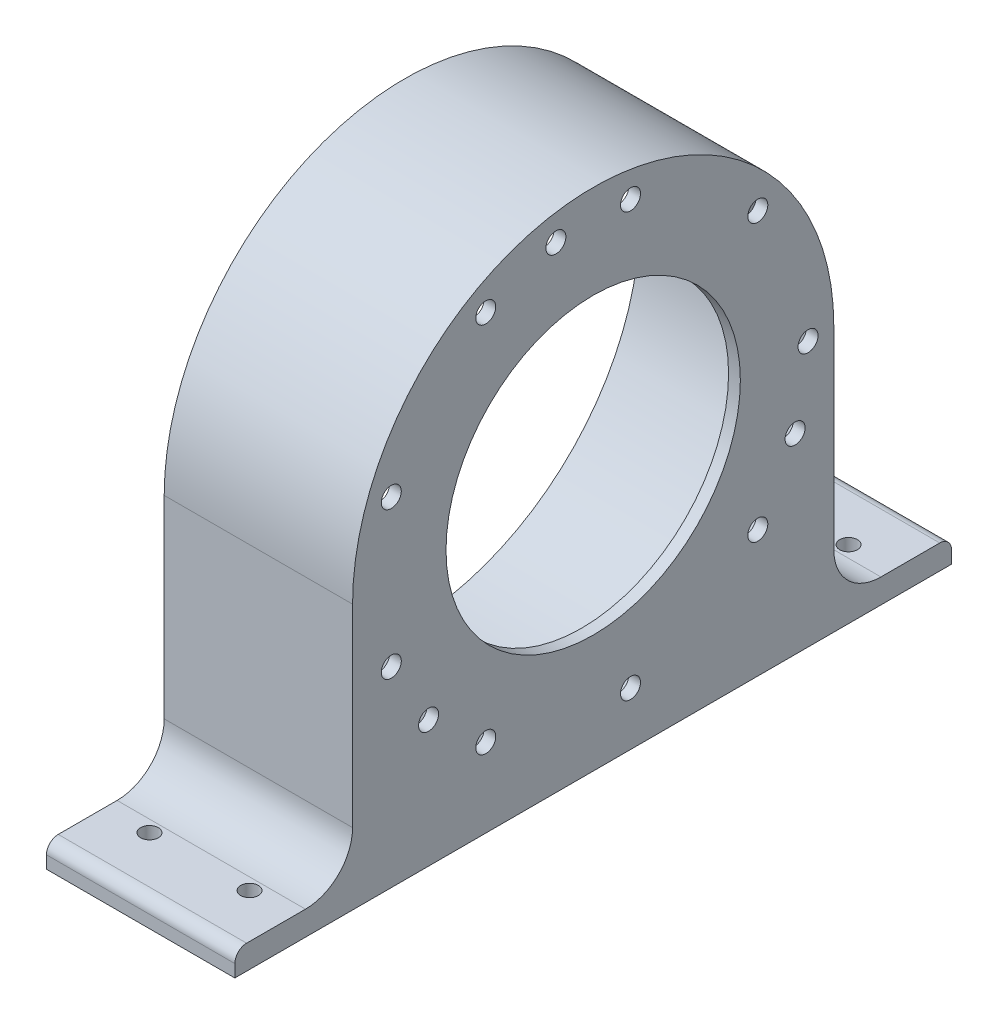
ISO-10303-21;
HEADER;
FILE_DESCRIPTION(('STEP AP214'),'2;1');
FILE_NAME('part.step','',(''),(''),'','','');
FILE_SCHEMA(('AUTOMOTIVE_DESIGN { 1 0 10303 214 1 1 1 1 }'));
ENDSEC;
DATA;
#1=APPLICATION_CONTEXT('core data for automotive mechanical design processes');
#2=APPLICATION_PROTOCOL_DEFINITION('international standard','automotive_design',2000,#1);
#3=PRODUCT_CONTEXT('',#1,'mechanical');
#4=PRODUCT('Part','Part','',(#3));
#5=PRODUCT_RELATED_PRODUCT_CATEGORY('part','',(#4));
#6=PRODUCT_DEFINITION_FORMATION('','',#4);
#7=PRODUCT_DEFINITION_CONTEXT('part definition',#1,'design');
#8=PRODUCT_DEFINITION('design','',#6,#7);
#9=PRODUCT_DEFINITION_SHAPE('','',#8);
#10=(LENGTH_UNIT() NAMED_UNIT(*) SI_UNIT(.MILLI.,.METRE.));
#11=(NAMED_UNIT(*) PLANE_ANGLE_UNIT() SI_UNIT($,.RADIAN.));
#12=(NAMED_UNIT(*) SI_UNIT($,.STERADIAN.) SOLID_ANGLE_UNIT());
#13=UNCERTAINTY_MEASURE_WITH_UNIT(LENGTH_MEASURE(1.E-05),#10,'distance_accuracy_value','');
#14=(GEOMETRIC_REPRESENTATION_CONTEXT(3) GLOBAL_UNCERTAINTY_ASSIGNED_CONTEXT((#13)) GLOBAL_UNIT_ASSIGNED_CONTEXT((#10,
#11,#12)) REPRESENTATION_CONTEXT('',''));
#15=CARTESIAN_POINT('',(0.,0.,0.));
#16=DIRECTION('',(0.,0.,1.));
#17=DIRECTION('',(1.,0.,0.));
#18=AXIS2_PLACEMENT_3D('',#15,#16,#17);
#19=CARTESIAN_POINT('',(-32.,0.,0.));
#20=DIRECTION('',(1.,0.,0.));
#21=DIRECTION('',(0.,0.,-1.));
#22=AXIS2_PLACEMENT_3D('',#19,#20,#21);
#23=CYLINDRICAL_SURFACE('',#22,40.875);
#24=CARTESIAN_POINT('',(0.,0.,0.));
#25=DIRECTION('',(1.,0.,0.));
#26=DIRECTION('',(0.,0.,1.));
#27=AXIS2_PLACEMENT_3D('',#24,#25,#26);
#28=CIRCLE('',#27,40.875);
#29=CARTESIAN_POINT('',(0.,0.,-40.875));
#30=VERTEX_POINT('',#29);
#31=CARTESIAN_POINT('',(0.,0.,40.875));
#32=VERTEX_POINT('',#31);
#33=EDGE_CURVE('E181',#30,#32,#28,.T.);
#34=ORIENTED_EDGE('',*,*,#33,.F.);
#35=DIRECTION('',(1.,0.,0.));
#36=VECTOR('',#35,1.);
#37=CARTESIAN_POINT('',(-32.,0.,-40.875));
#38=LINE('',#37,#36);
#39=CARTESIAN_POINT('',(-32.,0.,-40.875));
#40=VERTEX_POINT('',#39);
#41=EDGE_CURVE('E160',#40,#30,#38,.T.);
#42=ORIENTED_EDGE('',*,*,#41,.F.);
#43=CARTESIAN_POINT('',(-32.,0.,0.));
#44=DIRECTION('',(1.,0.,0.));
#45=DIRECTION('',(0.,0.,1.));
#46=AXIS2_PLACEMENT_3D('',#43,#44,#45);
#47=CIRCLE('',#46,40.875);
#48=CARTESIAN_POINT('',(-32.,0.,40.875));
#49=VERTEX_POINT('',#48);
#50=EDGE_CURVE('E153',#40,#49,#47,.T.);
#51=ORIENTED_EDGE('',*,*,#50,.T.);
#52=DIRECTION('',(1.,0.,0.));
#53=VECTOR('',#52,1.);
#54=CARTESIAN_POINT('',(-32.,0.,40.875));
#55=LINE('',#54,#53);
#56=EDGE_CURVE('E134',#49,#32,#55,.T.);
#57=ORIENTED_EDGE('',*,*,#56,.T.);
#58=EDGE_LOOP('',(#34,#42,#51,#57));
#59=FACE_BOUND('',#58,.T.);
#60=ADVANCED_FACE('F43',(#59),#23,.T.);
#61=CARTESIAN_POINT('',(-32.,-40.875,-40.875));
#62=DIRECTION('',(0.,0.,-1.));
#63=DIRECTION('',(-1.,0.,0.));
#64=AXIS2_PLACEMENT_3D('',#61,#62,#63);
#65=PLANE('',#64);
#66=DIRECTION('',(0.,1.,0.));
#67=VECTOR('',#66,1.);
#68=CARTESIAN_POINT('',(0.,-40.875,-40.875));
#69=LINE('',#68,#67);
#70=CARTESIAN_POINT('',(0.,-32.875,-40.875));
#71=VERTEX_POINT('',#70);
#72=EDGE_CURVE('E161',#71,#30,#69,.T.);
#73=ORIENTED_EDGE('',*,*,#72,.F.);
#74=DIRECTION('',(1.,0.,0.));
#75=VECTOR('',#74,1.);
#76=CARTESIAN_POINT('',(-32.,-32.875,-40.875));
#77=LINE('',#76,#75);
#78=CARTESIAN_POINT('',(-32.,-32.875,-40.875));
#79=VERTEX_POINT('',#78);
#80=EDGE_CURVE('E217',#71,#79,#77,.F.);
#81=ORIENTED_EDGE('',*,*,#80,.T.);
#82=DIRECTION('',(0.,1.,0.));
#83=VECTOR('',#82,1.);
#84=CARTESIAN_POINT('',(-32.,-40.875,-40.875));
#85=LINE('',#84,#83);
#86=EDGE_CURVE('E147',#79,#40,#85,.T.);
#87=ORIENTED_EDGE('',*,*,#86,.T.);
#88=ORIENTED_EDGE('',*,*,#41,.T.);
#89=EDGE_LOOP('',(#73,#81,#87,#88));
#90=FACE_BOUND('',#89,.T.);
#91=ADVANCED_FACE('F362',(#90),#65,.T.);
#92=CARTESIAN_POINT('',(-32.,-40.8749999999999,-60.875));
#93=DIRECTION('',(0.,1.,0.));
#94=DIRECTION('',(0.,0.,1.));
#95=AXIS2_PLACEMENT_3D('',#92,#93,#94);
#96=PLANE('',#95);
#97=CARTESIAN_POINT('',(-24.5,-40.875,-50.875));
#98=DIRECTION('',(0.,1.,0.));
#99=DIRECTION('',(0.,0.,1.));
#100=AXIS2_PLACEMENT_3D('',#97,#98,#99);
#101=CIRCLE('',#100,1.5);
#102=CARTESIAN_POINT('',(-24.5,-40.875,-49.375));
#103=VERTEX_POINT('',#102);
#104=EDGE_CURVE('E245',#103,#103,#101,.F.);
#105=ORIENTED_EDGE('',*,*,#104,.T.);
#106=EDGE_LOOP('',(#105));
#107=FACE_BOUND('',#106,.T.);
#108=CARTESIAN_POINT('',(-7.5,-40.875,-50.875));
#109=DIRECTION('',(0.,1.,0.));
#110=DIRECTION('',(0.,0.,1.));
#111=AXIS2_PLACEMENT_3D('',#108,#109,#110);
#112=CIRCLE('',#111,1.5);
#113=CARTESIAN_POINT('',(-7.5,-40.875,-49.375));
#114=VERTEX_POINT('',#113);
#115=EDGE_CURVE('E299',#114,#114,#112,.F.);
#116=ORIENTED_EDGE('',*,*,#115,.T.);
#117=EDGE_LOOP('',(#116));
#118=FACE_BOUND('',#117,.T.);
#119=DIRECTION('',(0.,0.,1.));
#120=VECTOR('',#119,1.);
#121=CARTESIAN_POINT('',(0.,-40.8749999999999,-60.875));
#122=LINE('',#121,#120);
#123=CARTESIAN_POINT('',(0.,-40.8749999999999,-58.875));
#124=VERTEX_POINT('',#123);
#125=CARTESIAN_POINT('',(0.,-40.875,-48.875));
#126=VERTEX_POINT('',#125);
#127=EDGE_CURVE('E163',#124,#126,#122,.T.);
#128=ORIENTED_EDGE('',*,*,#127,.F.);
#129=DIRECTION('',(1.,0.,0.));
#130=VECTOR('',#129,1.);
#131=CARTESIAN_POINT('',(-32.,-40.8749999999999,-58.875));
#132=LINE('',#131,#130);
#133=CARTESIAN_POINT('',(-32.,-40.8749999999999,-58.875));
#134=VERTEX_POINT('',#133);
#135=EDGE_CURVE('E234',#124,#134,#132,.F.);
#136=ORIENTED_EDGE('',*,*,#135,.T.);
#137=DIRECTION('',(0.,0.,1.));
#138=VECTOR('',#137,1.);
#139=CARTESIAN_POINT('',(-32.,-40.8749999999999,-60.875));
#140=LINE('',#139,#138);
#141=CARTESIAN_POINT('',(-32.,-40.875,-48.875));
#142=VERTEX_POINT('',#141);
#143=EDGE_CURVE('E178',#134,#142,#140,.T.);
#144=ORIENTED_EDGE('',*,*,#143,.T.);
#145=DIRECTION('',(1.,0.,0.));
#146=VECTOR('',#145,1.);
#147=CARTESIAN_POINT('',(0.,-40.875,-48.875));
#148=LINE('',#147,#146);
#149=EDGE_CURVE('E214',#142,#126,#148,.T.);
#150=ORIENTED_EDGE('',*,*,#149,.T.);
#151=EDGE_LOOP('',(#128,#136,#144,#150));
#152=FACE_BOUND('',#151,.T.);
#153=ADVANCED_FACE('F368',(#107,#118,#152),#96,.T.);
#154=CARTESIAN_POINT('',(-32.,-40.8749999999999,-60.875));
#155=DIRECTION('',(0.,0.,-1.));
#156=DIRECTION('',(-1.,0.,0.));
#157=AXIS2_PLACEMENT_3D('',#154,#155,#156);
#158=PLANE('',#157);
#159=DIRECTION('',(0.,1.,0.));
#160=VECTOR('',#159,1.);
#161=CARTESIAN_POINT('',(-32.,-40.8749999999999,-60.875));
#162=LINE('',#161,#160);
#163=CARTESIAN_POINT('',(-32.,-45.,-60.875));
#164=VERTEX_POINT('',#163);
#165=CARTESIAN_POINT('',(-32.,-42.8749999999999,-60.875));
#166=VERTEX_POINT('',#165);
#167=EDGE_CURVE('E175',#164,#166,#162,.T.);
#168=ORIENTED_EDGE('',*,*,#167,.T.);
#169=DIRECTION('',(1.,0.,0.));
#170=VECTOR('',#169,1.);
#171=CARTESIAN_POINT('',(-32.,-42.8749999999999,-60.875));
#172=LINE('',#171,#170);
#173=CARTESIAN_POINT('',(0.,-42.8749999999999,-60.875));
#174=VERTEX_POINT('',#173);
#175=EDGE_CURVE('E227',#166,#174,#172,.T.);
#176=ORIENTED_EDGE('',*,*,#175,.T.);
#177=DIRECTION('',(0.,1.,0.));
#178=VECTOR('',#177,1.);
#179=CARTESIAN_POINT('',(0.,-40.8749999999999,-60.875));
#180=LINE('',#179,#178);
#181=CARTESIAN_POINT('',(0.,-45.,-60.875));
#182=VERTEX_POINT('',#181);
#183=EDGE_CURVE('E193',#182,#174,#180,.T.);
#184=ORIENTED_EDGE('',*,*,#183,.F.);
#185=DIRECTION('',(1.,0.,0.));
#186=VECTOR('',#185,1.);
#187=CARTESIAN_POINT('',(-32.,-45.,-60.875));
#188=LINE('',#187,#186);
#189=EDGE_CURVE('E199',#164,#182,#188,.T.);
#190=ORIENTED_EDGE('',*,*,#189,.F.);
#191=EDGE_LOOP('',(#168,#176,#184,#190));
#192=FACE_BOUND('',#191,.T.);
#193=ADVANCED_FACE('F391',(#192),#158,.T.);
#194=CARTESIAN_POINT('',(-32.,-45.,60.875));
#195=DIRECTION('',(0.,-1.,0.));
#196=DIRECTION('',(0.,0.,-1.));
#197=AXIS2_PLACEMENT_3D('',#194,#195,#196);
#198=PLANE('',#197);
#199=CARTESIAN_POINT('',(-7.5,-45.,50.875));
#200=DIRECTION('',(0.,-1.,0.));
#201=DIRECTION('',(0.,0.,-1.));
#202=AXIS2_PLACEMENT_3D('',#199,#200,#201);
#203=CIRCLE('',#202,1.5);
#204=CARTESIAN_POINT('',(-7.5,-45.,49.375));
#205=VERTEX_POINT('',#204);
#206=EDGE_CURVE('E296',#205,#205,#203,.F.);
#207=ORIENTED_EDGE('',*,*,#206,.T.);
#208=EDGE_LOOP('',(#207));
#209=FACE_BOUND('',#208,.T.);
#210=CARTESIAN_POINT('',(-24.5,-45.,50.875));
#211=DIRECTION('',(0.,-1.,0.));
#212=DIRECTION('',(0.,0.,-1.));
#213=AXIS2_PLACEMENT_3D('',#210,#211,#212);
#214=CIRCLE('',#213,1.5);
#215=CARTESIAN_POINT('',(-24.5,-45.,49.375));
#216=VERTEX_POINT('',#215);
#217=EDGE_CURVE('E293',#216,#216,#214,.F.);
#218=ORIENTED_EDGE('',*,*,#217,.T.);
#219=EDGE_LOOP('',(#218));
#220=FACE_BOUND('',#219,.T.);
#221=CARTESIAN_POINT('',(-24.5,-45.,-50.875));
#222=DIRECTION('',(0.,-1.,0.));
#223=DIRECTION('',(0.,0.,-1.));
#224=AXIS2_PLACEMENT_3D('',#221,#222,#223);
#225=CIRCLE('',#224,1.5);
#226=CARTESIAN_POINT('',(-24.5,-45.,-52.375));
#227=VERTEX_POINT('',#226);
#228=EDGE_CURVE('E47',#227,#227,#225,.F.);
#229=ORIENTED_EDGE('',*,*,#228,.T.);
#230=EDGE_LOOP('',(#229));
#231=FACE_BOUND('',#230,.T.);
#232=CARTESIAN_POINT('',(-7.5,-45.,-50.875));
#233=DIRECTION('',(0.,-1.,0.));
#234=DIRECTION('',(0.,0.,-1.));
#235=AXIS2_PLACEMENT_3D('',#232,#233,#234);
#236=CIRCLE('',#235,1.5);
#237=CARTESIAN_POINT('',(-7.5,-45.,-52.375));
#238=VERTEX_POINT('',#237);
#239=EDGE_CURVE('E297',#238,#238,#236,.F.);
#240=ORIENTED_EDGE('',*,*,#239,.T.);
#241=EDGE_LOOP('',(#240));
#242=FACE_BOUND('',#241,.T.);
#243=DIRECTION('',(0.,0.,-1.));
#244=VECTOR('',#243,1.);
#245=CARTESIAN_POINT('',(0.,-45.,60.875));
#246=LINE('',#245,#244);
#247=CARTESIAN_POINT('',(0.,-45.,60.875));
#248=VERTEX_POINT('',#247);
#249=EDGE_CURVE('E190',#248,#182,#246,.T.);
#250=ORIENTED_EDGE('',*,*,#249,.F.);
#251=DIRECTION('',(1.,0.,0.));
#252=VECTOR('',#251,1.);
#253=CARTESIAN_POINT('',(-32.,-45.,60.875));
#254=LINE('',#253,#252);
#255=CARTESIAN_POINT('',(-32.,-45.,60.875));
#256=VERTEX_POINT('',#255);
#257=EDGE_CURVE('E146',#256,#248,#254,.T.);
#258=ORIENTED_EDGE('',*,*,#257,.F.);
#259=DIRECTION('',(0.,0.,-1.));
#260=VECTOR('',#259,1.);
#261=CARTESIAN_POINT('',(-32.,-45.,60.875));
#262=LINE('',#261,#260);
#263=EDGE_CURVE('E172',#256,#164,#262,.T.);
#264=ORIENTED_EDGE('',*,*,#263,.T.);
#265=ORIENTED_EDGE('',*,*,#189,.T.);
#266=EDGE_LOOP('',(#250,#258,#264,#265));
#267=FACE_BOUND('',#266,.T.);
#268=ADVANCED_FACE('F395',(#209,#220,#231,#242,#267),#198,.T.);
#269=CARTESIAN_POINT('',(-32.,-40.875,60.875));
#270=DIRECTION('',(0.,0.,1.));
#271=DIRECTION('',(1.,0.,0.));
#272=AXIS2_PLACEMENT_3D('',#269,#270,#271);
#273=PLANE('',#272);
#274=DIRECTION('',(0.,-1.,0.));
#275=VECTOR('',#274,1.);
#276=CARTESIAN_POINT('',(0.,-40.875,60.875));
#277=LINE('',#276,#275);
#278=CARTESIAN_POINT('',(0.,-42.875,60.875));
#279=VERTEX_POINT('',#278);
#280=EDGE_CURVE('E188',#279,#248,#277,.T.);
#281=ORIENTED_EDGE('',*,*,#280,.F.);
#282=DIRECTION('',(1.,0.,0.));
#283=VECTOR('',#282,1.);
#284=CARTESIAN_POINT('',(-32.,-42.875,60.875));
#285=LINE('',#284,#283);
#286=CARTESIAN_POINT('',(-32.,-42.875,60.875));
#287=VERTEX_POINT('',#286);
#288=EDGE_CURVE('E11',#279,#287,#285,.F.);
#289=ORIENTED_EDGE('',*,*,#288,.T.);
#290=DIRECTION('',(0.,-1.,0.));
#291=VECTOR('',#290,1.);
#292=CARTESIAN_POINT('',(-32.,-40.875,60.875));
#293=LINE('',#292,#291);
#294=EDGE_CURVE('E170',#287,#256,#293,.T.);
#295=ORIENTED_EDGE('',*,*,#294,.T.);
#296=ORIENTED_EDGE('',*,*,#257,.T.);
#297=EDGE_LOOP('',(#281,#289,#295,#296));
#298=FACE_BOUND('',#297,.T.);
#299=ADVANCED_FACE('F411',(#298),#273,.T.);
#300=CARTESIAN_POINT('',(-32.,-40.875,60.875));
#301=DIRECTION('',(0.,1.,0.));
#302=DIRECTION('',(0.,0.,1.));
#303=AXIS2_PLACEMENT_3D('',#300,#301,#302);
#304=PLANE('',#303);
#305=CARTESIAN_POINT('',(-7.5,-40.875,50.875));
#306=DIRECTION('',(0.,1.,0.));
#307=DIRECTION('',(0.,0.,1.));
#308=AXIS2_PLACEMENT_3D('',#305,#306,#307);
#309=CIRCLE('',#308,1.5);
#310=CARTESIAN_POINT('',(-7.5,-40.875,52.375));
#311=VERTEX_POINT('',#310);
#312=EDGE_CURVE('E294',#311,#311,#309,.F.);
#313=ORIENTED_EDGE('',*,*,#312,.T.);
#314=EDGE_LOOP('',(#313));
#315=FACE_BOUND('',#314,.T.);
#316=CARTESIAN_POINT('',(-24.5,-40.875,50.875));
#317=DIRECTION('',(0.,1.,0.));
#318=DIRECTION('',(0.,0.,1.));
#319=AXIS2_PLACEMENT_3D('',#316,#317,#318);
#320=CIRCLE('',#319,1.5);
#321=CARTESIAN_POINT('',(-24.5,-40.875,52.375));
#322=VERTEX_POINT('',#321);
#323=EDGE_CURVE('E290',#322,#322,#320,.F.);
#324=ORIENTED_EDGE('',*,*,#323,.T.);
#325=EDGE_LOOP('',(#324));
#326=FACE_BOUND('',#325,.T.);
#327=DIRECTION('',(0.,0.,1.));
#328=VECTOR('',#327,1.);
#329=CARTESIAN_POINT('',(-32.,-40.875,60.875));
#330=LINE('',#329,#328);
#331=CARTESIAN_POINT('',(-32.,-40.875,48.875));
#332=VERTEX_POINT('',#331);
#333=CARTESIAN_POINT('',(-32.,-40.875,58.875));
#334=VERTEX_POINT('',#333);
#335=EDGE_CURVE('E156',#332,#334,#330,.T.);
#336=ORIENTED_EDGE('',*,*,#335,.T.);
#337=DIRECTION('',(1.,0.,0.));
#338=VECTOR('',#337,1.);
#339=CARTESIAN_POINT('',(-32.,-40.875,58.875));
#340=LINE('',#339,#338);
#341=CARTESIAN_POINT('',(0.,-40.875,58.875));
#342=VERTEX_POINT('',#341);
#343=EDGE_CURVE('E52',#334,#342,#340,.T.);
#344=ORIENTED_EDGE('',*,*,#343,.T.);
#345=DIRECTION('',(0.,0.,1.));
#346=VECTOR('',#345,1.);
#347=CARTESIAN_POINT('',(0.,-40.875,60.875));
#348=LINE('',#347,#346);
#349=CARTESIAN_POINT('',(0.,-40.875,48.875));
#350=VERTEX_POINT('',#349);
#351=EDGE_CURVE('E185',#350,#342,#348,.T.);
#352=ORIENTED_EDGE('',*,*,#351,.F.);
#353=DIRECTION('',(1.,0.,0.));
#354=VECTOR('',#353,1.);
#355=CARTESIAN_POINT('',(-32.,-40.875,48.875));
#356=LINE('',#355,#354);
#357=EDGE_CURVE('E212',#350,#332,#356,.F.);
#358=ORIENTED_EDGE('',*,*,#357,.T.);
#359=EDGE_LOOP('',(#336,#344,#352,#358));
#360=FACE_BOUND('',#359,.T.);
#361=ADVANCED_FACE('F400',(#315,#326,#360),#304,.T.);
#362=CARTESIAN_POINT('',(-32.,0.,40.875));
#363=DIRECTION('',(0.,0.,1.));
#364=DIRECTION('',(1.,0.,0.));
#365=AXIS2_PLACEMENT_3D('',#362,#363,#364);
#366=PLANE('',#365);
#367=DIRECTION('',(0.,-1.,0.));
#368=VECTOR('',#367,1.);
#369=CARTESIAN_POINT('',(-32.,0.,40.875));
#370=LINE('',#369,#368);
#371=CARTESIAN_POINT('',(-32.,-32.875,40.875));
#372=VERTEX_POINT('',#371);
#373=EDGE_CURVE('E138',#49,#372,#370,.T.);
#374=ORIENTED_EDGE('',*,*,#373,.T.);
#375=DIRECTION('',(1.,0.,0.));
#376=VECTOR('',#375,1.);
#377=CARTESIAN_POINT('',(0.,-32.875,40.875));
#378=LINE('',#377,#376);
#379=CARTESIAN_POINT('',(0.,-32.875,40.875));
#380=VERTEX_POINT('',#379);
#381=EDGE_CURVE('E198',#372,#380,#378,.T.);
#382=ORIENTED_EDGE('',*,*,#381,.T.);
#383=DIRECTION('',(0.,-1.,0.));
#384=VECTOR('',#383,1.);
#385=CARTESIAN_POINT('',(0.,0.,40.875));
#386=LINE('',#385,#384);
#387=EDGE_CURVE('E141',#32,#380,#386,.T.);
#388=ORIENTED_EDGE('',*,*,#387,.F.);
#389=ORIENTED_EDGE('',*,*,#56,.F.);
#390=EDGE_LOOP('',(#374,#382,#388,#389));
#391=FACE_BOUND('',#390,.T.);
#392=ADVANCED_FACE('F136',(#391),#366,.T.);
#393=CARTESIAN_POINT('',(-32.,0.,0.));
#394=DIRECTION('',(-1.,0.,0.));
#395=DIRECTION('',(0.,0.,1.));
#396=AXIS2_PLACEMENT_3D('',#393,#394,#395);
#397=PLANE('',#396);
#398=CARTESIAN_POINT('',(-32.,0.,0.));
#399=DIRECTION('',(-1.,0.,0.));
#400=DIRECTION('',(0.,0.,1.));
#401=AXIS2_PLACEMENT_3D('',#398,#399,#400);
#402=CIRCLE('',#401,39.875);
#403=CARTESIAN_POINT('',(-32.,0.,39.875));
#404=VERTEX_POINT('',#403);
#405=EDGE_CURVE('E205',#404,#404,#402,.T.);
#406=ORIENTED_EDGE('',*,*,#405,.F.);
#407=EDGE_LOOP('',(#406));
#408=FACE_BOUND('',#407,.T.);
#409=ORIENTED_EDGE('',*,*,#143,.F.);
#410=CARTESIAN_POINT('',(-32.,-42.8749999999999,-58.875));
#411=DIRECTION('',(-1.,0.,0.));
#412=DIRECTION('',(0.,0.,1.));
#413=AXIS2_PLACEMENT_3D('',#410,#411,#412);
#414=CIRCLE('',#413,2.);
#415=EDGE_CURVE('E237',#134,#166,#414,.T.);
#416=ORIENTED_EDGE('',*,*,#415,.T.);
#417=ORIENTED_EDGE('',*,*,#167,.F.);
#418=ORIENTED_EDGE('',*,*,#263,.F.);
#419=ORIENTED_EDGE('',*,*,#294,.F.);
#420=CARTESIAN_POINT('',(-32.,-42.875,58.875));
#421=DIRECTION('',(-1.,0.,0.));
#422=DIRECTION('',(0.,0.,1.));
#423=AXIS2_PLACEMENT_3D('',#420,#421,#422);
#424=CIRCLE('',#423,2.);
#425=EDGE_CURVE('E60',#287,#334,#424,.T.);
#426=ORIENTED_EDGE('',*,*,#425,.T.);
#427=ORIENTED_EDGE('',*,*,#335,.F.);
#428=CARTESIAN_POINT('',(-32.,-32.875,48.875));
#429=DIRECTION('',(-1.,0.,0.));
#430=DIRECTION('',(0.,0.,1.));
#431=AXIS2_PLACEMENT_3D('',#428,#429,#430);
#432=CIRCLE('',#431,8.);
#433=EDGE_CURVE('E155',#332,#372,#432,.F.);
#434=ORIENTED_EDGE('',*,*,#433,.T.);
#435=ORIENTED_EDGE('',*,*,#373,.F.);
#436=ORIENTED_EDGE('',*,*,#50,.F.);
#437=ORIENTED_EDGE('',*,*,#86,.F.);
#438=CARTESIAN_POINT('',(-32.,-32.875,-48.875));
#439=DIRECTION('',(-1.,0.,0.));
#440=DIRECTION('',(0.,0.,1.));
#441=AXIS2_PLACEMENT_3D('',#438,#439,#440);
#442=CIRCLE('',#441,8.);
#443=EDGE_CURVE('E224',#79,#142,#442,.F.);
#444=ORIENTED_EDGE('',*,*,#443,.T.);
#445=EDGE_LOOP('',(#409,#416,#417,#418,#419,#426,#427,#434,#435,#436,#437,#444));
#446=FACE_BOUND('',#445,.T.);
#447=ADVANCED_FACE('F151',(#408,#446),#397,.T.);
#448=CARTESIAN_POINT('',(0.,0.,0.));
#449=DIRECTION('',(-1.,0.,0.));
#450=DIRECTION('',(0.,0.,1.));
#451=AXIS2_PLACEMENT_3D('',#448,#449,#450);
#452=PLANE('',#451);
#453=CARTESIAN_POINT('',(0.,35.9454829849455,-6.33815848484333));
#454=DIRECTION('',(-1.,0.,0.));
#455=DIRECTION('',(0.,0.,1.));
#456=AXIS2_PLACEMENT_3D('',#453,#454,#455);
#457=CIRCLE('',#456,1.7);
#458=CARTESIAN_POINT('',(0.,35.9454829849455,-4.63815848484333));
#459=VERTEX_POINT('',#458);
#460=EDGE_CURVE('E289',#459,#459,#457,.F.);
#461=ORIENTED_EDGE('',*,*,#460,.F.);
#462=EDGE_LOOP('',(#461));
#463=FACE_BOUND('',#462,.T.);
#464=CARTESIAN_POINT('',(0.,31.6099272381322,18.2499999999997));
#465=DIRECTION('',(-1.,0.,0.));
#466=DIRECTION('',(0.,0.,1.));
#467=AXIS2_PLACEMENT_3D('',#464,#465,#466);
#468=CIRCLE('',#467,1.7);
#469=CARTESIAN_POINT('',(0.,31.6099272381322,19.9499999999997));
#470=VERTEX_POINT('',#469);
#471=EDGE_CURVE('E285',#470,#470,#468,.F.);
#472=ORIENTED_EDGE('',*,*,#471,.F.);
#473=EDGE_LOOP('',(#472));
#474=FACE_BOUND('',#473,.T.);
#475=CARTESIAN_POINT('',(0.,12.4837352313872,34.2987806586856));
#476=DIRECTION('',(-1.,0.,0.));
#477=DIRECTION('',(0.,0.,1.));
#478=AXIS2_PLACEMENT_3D('',#475,#476,#477);
#479=CIRCLE('',#478,1.7);
#480=CARTESIAN_POINT('',(0.,12.4837352313872,35.9987806586856));
#481=VERTEX_POINT('',#480);
#482=EDGE_CURVE('E281',#481,#481,#479,.F.);
#483=ORIENTED_EDGE('',*,*,#482,.F.);
#484=EDGE_LOOP('',(#483));
#485=FACE_BOUND('',#484,.T.);
#486=CARTESIAN_POINT('',(0.,-12.4837352313867,34.2987806586857));
#487=DIRECTION('',(-1.,0.,0.));
#488=DIRECTION('',(0.,0.,1.));
#489=AXIS2_PLACEMENT_3D('',#486,#487,#488);
#490=CIRCLE('',#489,1.7);
#491=CARTESIAN_POINT('',(0.,-12.4837352313867,35.9987806586857));
#492=VERTEX_POINT('',#491);
#493=EDGE_CURVE('E277',#492,#492,#490,.F.);
#494=ORIENTED_EDGE('',*,*,#493,.F.);
#495=EDGE_LOOP('',(#494));
#496=FACE_BOUND('',#495,.T.);
#497=CARTESIAN_POINT('',(0.,-31.6099272381319,18.2500000000001));
#498=DIRECTION('',(-1.,0.,0.));
#499=DIRECTION('',(0.,0.,1.));
#500=AXIS2_PLACEMENT_3D('',#497,#498,#499);
#501=CIRCLE('',#500,1.7);
#502=CARTESIAN_POINT('',(0.,-31.6099272381319,19.9500000000001));
#503=VERTEX_POINT('',#502);
#504=EDGE_CURVE('E273',#503,#503,#501,.F.);
#505=ORIENTED_EDGE('',*,*,#504,.F.);
#506=EDGE_LOOP('',(#505));
#507=FACE_BOUND('',#506,.T.);
#508=CARTESIAN_POINT('',(0.,-35.9454829849456,-6.33815848484285));
#509=DIRECTION('',(-1.,0.,0.));
#510=DIRECTION('',(0.,0.,1.));
#511=AXIS2_PLACEMENT_3D('',#508,#509,#510);
#512=CIRCLE('',#511,1.7);
#513=CARTESIAN_POINT('',(0.,-35.9454829849456,-4.63815848484285));
#514=VERTEX_POINT('',#513);
#515=EDGE_CURVE('E269',#514,#514,#512,.F.);
#516=ORIENTED_EDGE('',*,*,#515,.F.);
#517=EDGE_LOOP('',(#516));
#518=FACE_BOUND('',#517,.T.);
#519=CARTESIAN_POINT('',(0.,-23.4617477535587,-27.9606221738427));
#520=DIRECTION('',(-1.,0.,0.));
#521=DIRECTION('',(0.,0.,1.));
#522=AXIS2_PLACEMENT_3D('',#519,#520,#521);
#523=CIRCLE('',#522,1.7);
#524=CARTESIAN_POINT('',(0.,-23.4617477535587,-26.2606221738427));
#525=VERTEX_POINT('',#524);
#526=EDGE_CURVE('E265',#525,#525,#523,.F.);
#527=ORIENTED_EDGE('',*,*,#526,.F.);
#528=EDGE_LOOP('',(#527));
#529=FACE_BOUND('',#528,.T.);
#530=CARTESIAN_POINT('',(0.,-12.4837352313869,-34.2987806586857));
#531=DIRECTION('',(-1.,0.,0.));
#532=DIRECTION('',(0.,0.,1.));
#533=AXIS2_PLACEMENT_3D('',#530,#531,#532);
#534=CIRCLE('',#533,1.7);
#535=CARTESIAN_POINT('',(0.,-12.4837352313869,-32.5987806586857));
#536=VERTEX_POINT('',#535);
#537=EDGE_CURVE('E261',#536,#536,#534,.F.);
#538=ORIENTED_EDGE('',*,*,#537,.F.);
#539=EDGE_LOOP('',(#538));
#540=FACE_BOUND('',#539,.T.);
#541=CARTESIAN_POINT('',(0.,23.4617477535583,-27.960622173843));
#542=DIRECTION('',(-1.,0.,0.));
#543=DIRECTION('',(0.,0.,1.));
#544=AXIS2_PLACEMENT_3D('',#541,#542,#543);
#545=CIRCLE('',#544,1.7);
#546=CARTESIAN_POINT('',(0.,23.4617477535583,-26.260622173843));
#547=VERTEX_POINT('',#546);
#548=EDGE_CURVE('E257',#547,#547,#545,.F.);
#549=ORIENTED_EDGE('',*,*,#548,.F.);
#550=EDGE_LOOP('',(#549));
#551=FACE_BOUND('',#550,.T.);
#552=CARTESIAN_POINT('',(0.,-23.4617477535587,27.9606221738427));
#553=DIRECTION('',(-1.,0.,0.));
#554=DIRECTION('',(0.,0.,1.));
#555=AXIS2_PLACEMENT_3D('',#552,#553,#554);
#556=CIRCLE('',#555,1.7);
#557=CARTESIAN_POINT('',(0.,-23.4617477535587,29.6606221738427));
#558=VERTEX_POINT('',#557);
#559=EDGE_CURVE('E253',#558,#558,#556,.F.);
#560=ORIENTED_EDGE('',*,*,#559,.F.);
#561=EDGE_LOOP('',(#560));
#562=FACE_BOUND('',#561,.T.);
#563=CARTESIAN_POINT('',(0.,35.9454829849456,6.33815848484298));
#564=DIRECTION('',(-1.,0.,0.));
#565=DIRECTION('',(0.,0.,1.));
#566=AXIS2_PLACEMENT_3D('',#563,#564,#565);
#567=CIRCLE('',#566,1.7);
#568=CARTESIAN_POINT('',(0.,35.9454829849456,8.03815848484298));
#569=VERTEX_POINT('',#568);
#570=EDGE_CURVE('E249',#569,#569,#567,.F.);
#571=ORIENTED_EDGE('',*,*,#570,.F.);
#572=EDGE_LOOP('',(#571));
#573=FACE_BOUND('',#572,.T.);
#574=CARTESIAN_POINT('',(0.,0.,-36.5));
#575=DIRECTION('',(-1.,0.,0.));
#576=DIRECTION('',(0.,0.,1.));
#577=AXIS2_PLACEMENT_3D('',#574,#575,#576);
#578=CIRCLE('',#577,1.7);
#579=CARTESIAN_POINT('',(0.,0.,-34.8));
#580=VERTEX_POINT('',#579);
#581=EDGE_CURVE('E244',#580,#580,#578,.F.);
#582=ORIENTED_EDGE('',*,*,#581,.F.);
#583=EDGE_LOOP('',(#582));
#584=FACE_BOUND('',#583,.T.);
#585=CARTESIAN_POINT('',(0.,0.,0.));
#586=DIRECTION('',(-1.,0.,0.));
#587=DIRECTION('',(0.,0.,1.));
#588=AXIS2_PLACEMENT_3D('',#585,#586,#587);
#589=CIRCLE('',#588,25.);
#590=CARTESIAN_POINT('',(0.,0.,25.));
#591=VERTEX_POINT('',#590);
#592=EDGE_CURVE('E183',#591,#591,#589,.F.);
#593=ORIENTED_EDGE('',*,*,#592,.F.);
#594=EDGE_LOOP('',(#593));
#595=FACE_BOUND('',#594,.T.);
#596=ORIENTED_EDGE('',*,*,#183,.T.);
#597=CARTESIAN_POINT('',(0.,-42.8749999999999,-58.875));
#598=DIRECTION('',(-1.,0.,0.));
#599=DIRECTION('',(0.,0.,1.));
#600=AXIS2_PLACEMENT_3D('',#597,#598,#599);
#601=CIRCLE('',#600,2.);
#602=EDGE_CURVE('E232',#174,#124,#601,.F.);
#603=ORIENTED_EDGE('',*,*,#602,.T.);
#604=ORIENTED_EDGE('',*,*,#127,.T.);
#605=CARTESIAN_POINT('',(0.,-32.875,-48.875));
#606=DIRECTION('',(-1.,0.,0.));
#607=DIRECTION('',(0.,0.,1.));
#608=AXIS2_PLACEMENT_3D('',#605,#606,#607);
#609=CIRCLE('',#608,8.);
#610=EDGE_CURVE('E222',#126,#71,#609,.T.);
#611=ORIENTED_EDGE('',*,*,#610,.T.);
#612=ORIENTED_EDGE('',*,*,#72,.T.);
#613=ORIENTED_EDGE('',*,*,#33,.T.);
#614=ORIENTED_EDGE('',*,*,#387,.T.);
#615=CARTESIAN_POINT('',(0.,-32.875,48.875));
#616=DIRECTION('',(-1.,0.,0.));
#617=DIRECTION('',(0.,0.,1.));
#618=AXIS2_PLACEMENT_3D('',#615,#616,#617);
#619=CIRCLE('',#618,8.);
#620=EDGE_CURVE('E219',#380,#350,#619,.T.);
#621=ORIENTED_EDGE('',*,*,#620,.T.);
#622=ORIENTED_EDGE('',*,*,#351,.T.);
#623=CARTESIAN_POINT('',(0.,-42.875,58.875));
#624=DIRECTION('',(-1.,0.,0.));
#625=DIRECTION('',(0.,0.,1.));
#626=AXIS2_PLACEMENT_3D('',#623,#624,#625);
#627=CIRCLE('',#626,2.);
#628=EDGE_CURVE('E230',#342,#279,#627,.F.);
#629=ORIENTED_EDGE('',*,*,#628,.T.);
#630=ORIENTED_EDGE('',*,*,#280,.T.);
#631=ORIENTED_EDGE('',*,*,#249,.T.);
#632=EDGE_LOOP('',(#596,#603,#604,#611,#612,#613,#614,#621,#622,#629,#630,#631));
#633=FACE_BOUND('',#632,.T.);
#634=ADVANCED_FACE('F403',(#463,#474,#485,#496,#507,#518,#529,#540,#551,#562,#573,#584,#595,
#633),#452,.F.);
#635=CARTESIAN_POINT('',(10.,0.,0.));
#636=DIRECTION('',(-1.,0.,0.));
#637=DIRECTION('',(0.,0.,1.));
#638=AXIS2_PLACEMENT_3D('',#635,#636,#637);
#639=CYLINDRICAL_SURFACE('',#638,25.);
#640=CARTESIAN_POINT('',(-2.,0.,0.));
#641=DIRECTION('',(1.,0.,0.));
#642=DIRECTION('',(0.,0.,-1.));
#643=AXIS2_PLACEMENT_3D('',#640,#641,#642);
#644=CIRCLE('',#643,25.);
#645=CARTESIAN_POINT('',(-2.,0.,-25.));
#646=VERTEX_POINT('',#645);
#647=EDGE_CURVE('E206',#646,#646,#644,.T.);
#648=ORIENTED_EDGE('',*,*,#647,.F.);
#649=EDGE_LOOP('',(#648));
#650=FACE_BOUND('',#649,.T.);
#651=ORIENTED_EDGE('',*,*,#592,.T.);
#652=EDGE_LOOP('',(#651));
#653=FACE_BOUND('',#652,.T.);
#654=ADVANCED_FACE('F355',(#650,#653),#639,.F.);
#655=CARTESIAN_POINT('',(-42.,0.,0.));
#656=DIRECTION('',(1.,0.,0.));
#657=DIRECTION('',(0.,0.,-1.));
#658=AXIS2_PLACEMENT_3D('',#655,#656,#657);
#659=CYLINDRICAL_SURFACE('',#658,39.875);
#660=ORIENTED_EDGE('',*,*,#405,.T.);
#661=EDGE_LOOP('',(#660));
#662=FACE_BOUND('',#661,.T.);
#663=CARTESIAN_POINT('',(-2.,0.,0.));
#664=DIRECTION('',(1.,0.,0.));
#665=DIRECTION('',(0.,0.,-1.));
#666=AXIS2_PLACEMENT_3D('',#663,#664,#665);
#667=CIRCLE('',#666,39.875);
#668=CARTESIAN_POINT('',(-2.,0.,-39.875));
#669=VERTEX_POINT('',#668);
#670=EDGE_CURVE('E166',#669,#669,#667,.T.);
#671=ORIENTED_EDGE('',*,*,#670,.T.);
#672=EDGE_LOOP('',(#671));
#673=FACE_BOUND('',#672,.T.);
#674=ADVANCED_FACE('F339',(#662,#673),#659,.F.);
#675=CARTESIAN_POINT('',(-2.,0.,0.));
#676=DIRECTION('',(1.,0.,0.));
#677=DIRECTION('',(0.,0.,-1.));
#678=AXIS2_PLACEMENT_3D('',#675,#676,#677);
#679=PLANE('',#678);
#680=CARTESIAN_POINT('',(-2.,35.9454829849455,-6.33815848484333));
#681=DIRECTION('',(1.,0.,0.));
#682=DIRECTION('',(0.,0.,-1.));
#683=AXIS2_PLACEMENT_3D('',#680,#681,#682);
#684=CIRCLE('',#683,1.7);
#685=CARTESIAN_POINT('',(-2.,35.9454829849455,-8.03815848484333));
#686=VERTEX_POINT('',#685);
#687=EDGE_CURVE('E286',#686,#686,#684,.F.);
#688=ORIENTED_EDGE('',*,*,#687,.F.);
#689=EDGE_LOOP('',(#688));
#690=FACE_BOUND('',#689,.T.);
#691=CARTESIAN_POINT('',(-2.,31.6099272381322,18.2499999999997));
#692=DIRECTION('',(1.,0.,0.));
#693=DIRECTION('',(0.,0.,-1.));
#694=AXIS2_PLACEMENT_3D('',#691,#692,#693);
#695=CIRCLE('',#694,1.7);
#696=CARTESIAN_POINT('',(-2.,31.6099272381322,16.5499999999997));
#697=VERTEX_POINT('',#696);
#698=EDGE_CURVE('E282',#697,#697,#695,.F.);
#699=ORIENTED_EDGE('',*,*,#698,.F.);
#700=EDGE_LOOP('',(#699));
#701=FACE_BOUND('',#700,.T.);
#702=CARTESIAN_POINT('',(-2.,12.4837352313872,34.2987806586856));
#703=DIRECTION('',(1.,0.,0.));
#704=DIRECTION('',(0.,0.,-1.));
#705=AXIS2_PLACEMENT_3D('',#702,#703,#704);
#706=CIRCLE('',#705,1.7);
#707=CARTESIAN_POINT('',(-2.,12.4837352313872,32.5987806586856));
#708=VERTEX_POINT('',#707);
#709=EDGE_CURVE('E278',#708,#708,#706,.F.);
#710=ORIENTED_EDGE('',*,*,#709,.F.);
#711=EDGE_LOOP('',(#710));
#712=FACE_BOUND('',#711,.T.);
#713=CARTESIAN_POINT('',(-2.,-12.4837352313867,34.2987806586857));
#714=DIRECTION('',(1.,0.,0.));
#715=DIRECTION('',(0.,0.,-1.));
#716=AXIS2_PLACEMENT_3D('',#713,#714,#715);
#717=CIRCLE('',#716,1.7);
#718=CARTESIAN_POINT('',(-2.,-12.4837352313867,32.5987806586857));
#719=VERTEX_POINT('',#718);
#720=EDGE_CURVE('E274',#719,#719,#717,.F.);
#721=ORIENTED_EDGE('',*,*,#720,.F.);
#722=EDGE_LOOP('',(#721));
#723=FACE_BOUND('',#722,.T.);
#724=CARTESIAN_POINT('',(-2.,-31.6099272381319,18.2500000000001));
#725=DIRECTION('',(1.,0.,0.));
#726=DIRECTION('',(0.,0.,-1.));
#727=AXIS2_PLACEMENT_3D('',#724,#725,#726);
#728=CIRCLE('',#727,1.7);
#729=CARTESIAN_POINT('',(-2.,-31.6099272381319,16.5500000000001));
#730=VERTEX_POINT('',#729);
#731=EDGE_CURVE('E270',#730,#730,#728,.F.);
#732=ORIENTED_EDGE('',*,*,#731,.F.);
#733=EDGE_LOOP('',(#732));
#734=FACE_BOUND('',#733,.T.);
#735=CARTESIAN_POINT('',(-2.,-35.9454829849456,-6.33815848484285));
#736=DIRECTION('',(1.,0.,0.));
#737=DIRECTION('',(0.,0.,-1.));
#738=AXIS2_PLACEMENT_3D('',#735,#736,#737);
#739=CIRCLE('',#738,1.7);
#740=CARTESIAN_POINT('',(-2.,-35.9454829849456,-8.03815848484285));
#741=VERTEX_POINT('',#740);
#742=EDGE_CURVE('E266',#741,#741,#739,.F.);
#743=ORIENTED_EDGE('',*,*,#742,.F.);
#744=EDGE_LOOP('',(#743));
#745=FACE_BOUND('',#744,.T.);
#746=CARTESIAN_POINT('',(-2.,-23.4617477535587,-27.9606221738427));
#747=DIRECTION('',(1.,0.,0.));
#748=DIRECTION('',(0.,0.,-1.));
#749=AXIS2_PLACEMENT_3D('',#746,#747,#748);
#750=CIRCLE('',#749,1.7);
#751=CARTESIAN_POINT('',(-2.,-23.4617477535587,-29.6606221738427));
#752=VERTEX_POINT('',#751);
#753=EDGE_CURVE('E262',#752,#752,#750,.F.);
#754=ORIENTED_EDGE('',*,*,#753,.F.);
#755=EDGE_LOOP('',(#754));
#756=FACE_BOUND('',#755,.T.);
#757=CARTESIAN_POINT('',(-2.,-12.4837352313869,-34.2987806586857));
#758=DIRECTION('',(1.,0.,0.));
#759=DIRECTION('',(0.,0.,-1.));
#760=AXIS2_PLACEMENT_3D('',#757,#758,#759);
#761=CIRCLE('',#760,1.7);
#762=CARTESIAN_POINT('',(-2.,-12.4837352313869,-35.9987806586857));
#763=VERTEX_POINT('',#762);
#764=EDGE_CURVE('E258',#763,#763,#761,.F.);
#765=ORIENTED_EDGE('',*,*,#764,.F.);
#766=EDGE_LOOP('',(#765));
#767=FACE_BOUND('',#766,.T.);
#768=CARTESIAN_POINT('',(-2.,23.4617477535583,-27.960622173843));
#769=DIRECTION('',(1.,0.,0.));
#770=DIRECTION('',(0.,0.,-1.));
#771=AXIS2_PLACEMENT_3D('',#768,#769,#770);
#772=CIRCLE('',#771,1.7);
#773=CARTESIAN_POINT('',(-2.,23.4617477535583,-29.660622173843));
#774=VERTEX_POINT('',#773);
#775=EDGE_CURVE('E254',#774,#774,#772,.F.);
#776=ORIENTED_EDGE('',*,*,#775,.F.);
#777=EDGE_LOOP('',(#776));
#778=FACE_BOUND('',#777,.T.);
#779=CARTESIAN_POINT('',(-2.,-23.4617477535587,27.9606221738427));
#780=DIRECTION('',(1.,0.,0.));
#781=DIRECTION('',(0.,0.,-1.));
#782=AXIS2_PLACEMENT_3D('',#779,#780,#781);
#783=CIRCLE('',#782,1.7);
#784=CARTESIAN_POINT('',(-2.,-23.4617477535587,26.2606221738427));
#785=VERTEX_POINT('',#784);
#786=EDGE_CURVE('E250',#785,#785,#783,.F.);
#787=ORIENTED_EDGE('',*,*,#786,.F.);
#788=EDGE_LOOP('',(#787));
#789=FACE_BOUND('',#788,.T.);
#790=CARTESIAN_POINT('',(-2.,35.9454829849456,6.33815848484298));
#791=DIRECTION('',(1.,0.,0.));
#792=DIRECTION('',(0.,0.,-1.));
#793=AXIS2_PLACEMENT_3D('',#790,#791,#792);
#794=CIRCLE('',#793,1.7);
#795=CARTESIAN_POINT('',(-2.,35.9454829849456,4.63815848484297));
#796=VERTEX_POINT('',#795);
#797=EDGE_CURVE('E246',#796,#796,#794,.F.);
#798=ORIENTED_EDGE('',*,*,#797,.F.);
#799=EDGE_LOOP('',(#798));
#800=FACE_BOUND('',#799,.T.);
#801=CARTESIAN_POINT('',(-2.,0.,-36.5));
#802=DIRECTION('',(1.,0.,0.));
#803=DIRECTION('',(0.,0.,-1.));
#804=AXIS2_PLACEMENT_3D('',#801,#802,#803);
#805=CIRCLE('',#804,1.7);
#806=CARTESIAN_POINT('',(-2.,0.,-38.2));
#807=VERTEX_POINT('',#806);
#808=EDGE_CURVE('E241',#807,#807,#805,.F.);
#809=ORIENTED_EDGE('',*,*,#808,.F.);
#810=EDGE_LOOP('',(#809));
#811=FACE_BOUND('',#810,.T.);
#812=ORIENTED_EDGE('',*,*,#647,.T.);
#813=EDGE_LOOP('',(#812));
#814=FACE_BOUND('',#813,.T.);
#815=ORIENTED_EDGE('',*,*,#670,.F.);
#816=EDGE_LOOP('',(#815));
#817=FACE_BOUND('',#816,.T.);
#818=ADVANCED_FACE('F341',(#690,#701,#712,#723,#734,#745,#756,#767,#778,#789,#800,#811,#814,
#817),#679,.F.);
#819=CARTESIAN_POINT('',(-32.,-32.875,48.875));
#820=DIRECTION('',(-1.,0.,0.));
#821=DIRECTION('',(0.,0.,1.));
#822=AXIS2_PLACEMENT_3D('',#819,#820,#821);
#823=CYLINDRICAL_SURFACE('',#822,8.);
#824=ORIENTED_EDGE('',*,*,#433,.F.);
#825=ORIENTED_EDGE('',*,*,#357,.F.);
#826=ORIENTED_EDGE('',*,*,#620,.F.);
#827=ORIENTED_EDGE('',*,*,#381,.F.);
#828=EDGE_LOOP('',(#824,#825,#826,#827));
#829=FACE_BOUND('',#828,.T.);
#830=ADVANCED_FACE('F343',(#829),#823,.F.);
#831=CARTESIAN_POINT('',(-32.,-32.875,-48.875));
#832=DIRECTION('',(-1.,0.,0.));
#833=DIRECTION('',(0.,0.,1.));
#834=AXIS2_PLACEMENT_3D('',#831,#832,#833);
#835=CYLINDRICAL_SURFACE('',#834,8.);
#836=ORIENTED_EDGE('',*,*,#443,.F.);
#837=ORIENTED_EDGE('',*,*,#80,.F.);
#838=ORIENTED_EDGE('',*,*,#610,.F.);
#839=ORIENTED_EDGE('',*,*,#149,.F.);
#840=EDGE_LOOP('',(#836,#837,#838,#839));
#841=FACE_BOUND('',#840,.T.);
#842=ADVANCED_FACE('F351',(#841),#835,.F.);
#843=CARTESIAN_POINT('',(-32.,-42.8749999999999,-58.875));
#844=DIRECTION('',(1.,0.,0.));
#845=DIRECTION('',(0.,0.,-1.));
#846=AXIS2_PLACEMENT_3D('',#843,#844,#845);
#847=CYLINDRICAL_SURFACE('',#846,2.);
#848=ORIENTED_EDGE('',*,*,#415,.F.);
#849=ORIENTED_EDGE('',*,*,#135,.F.);
#850=ORIENTED_EDGE('',*,*,#602,.F.);
#851=ORIENTED_EDGE('',*,*,#175,.F.);
#852=EDGE_LOOP('',(#848,#849,#850,#851));
#853=FACE_BOUND('',#852,.T.);
#854=ADVANCED_FACE('F375',(#853),#847,.T.);
#855=CARTESIAN_POINT('',(-32.,-42.875,58.875));
#856=DIRECTION('',(1.,0.,0.));
#857=DIRECTION('',(0.,0.,-1.));
#858=AXIS2_PLACEMENT_3D('',#855,#856,#857);
#859=CYLINDRICAL_SURFACE('',#858,2.);
#860=ORIENTED_EDGE('',*,*,#425,.F.);
#861=ORIENTED_EDGE('',*,*,#288,.F.);
#862=ORIENTED_EDGE('',*,*,#628,.F.);
#863=ORIENTED_EDGE('',*,*,#343,.F.);
#864=EDGE_LOOP('',(#860,#861,#862,#863));
#865=FACE_BOUND('',#864,.T.);
#866=ADVANCED_FACE('F45',(#865),#859,.T.);
#867=CARTESIAN_POINT('',(10.,0.,-36.5));
#868=DIRECTION('',(-1.,0.,0.));
#869=DIRECTION('',(0.,0.,1.));
#870=AXIS2_PLACEMENT_3D('',#867,#868,#869);
#871=CYLINDRICAL_SURFACE('',#870,1.7);
#872=ORIENTED_EDGE('',*,*,#808,.T.);
#873=EDGE_LOOP('',(#872));
#874=FACE_BOUND('',#873,.T.);
#875=ORIENTED_EDGE('',*,*,#581,.T.);
#876=EDGE_LOOP('',(#875));
#877=FACE_BOUND('',#876,.T.);
#878=ADVANCED_FACE('F383',(#874,#877),#871,.F.);
#879=CARTESIAN_POINT('',(10.,35.9454829849456,6.33815848484298));
#880=DIRECTION('',(-1.,0.,0.));
#881=DIRECTION('',(0.,0.,1.));
#882=AXIS2_PLACEMENT_3D('',#879,#880,#881);
#883=CYLINDRICAL_SURFACE('',#882,1.7);
#884=ORIENTED_EDGE('',*,*,#797,.T.);
#885=EDGE_LOOP('',(#884));
#886=FACE_BOUND('',#885,.T.);
#887=ORIENTED_EDGE('',*,*,#570,.T.);
#888=EDGE_LOOP('',(#887));
#889=FACE_BOUND('',#888,.T.);
#890=ADVANCED_FACE('F622',(#886,#889),#883,.F.);
#891=CARTESIAN_POINT('',(10.,-23.4617477535587,27.9606221738427));
#892=DIRECTION('',(-1.,0.,0.));
#893=DIRECTION('',(0.,0.,1.));
#894=AXIS2_PLACEMENT_3D('',#891,#892,#893);
#895=CYLINDRICAL_SURFACE('',#894,1.7);
#896=ORIENTED_EDGE('',*,*,#786,.T.);
#897=EDGE_LOOP('',(#896));
#898=FACE_BOUND('',#897,.T.);
#899=ORIENTED_EDGE('',*,*,#559,.T.);
#900=EDGE_LOOP('',(#899));
#901=FACE_BOUND('',#900,.T.);
#902=ADVANCED_FACE('F613',(#898,#901),#895,.F.);
#903=CARTESIAN_POINT('',(10.,23.4617477535583,-27.960622173843));
#904=DIRECTION('',(-1.,0.,0.));
#905=DIRECTION('',(0.,0.,1.));
#906=AXIS2_PLACEMENT_3D('',#903,#904,#905);
#907=CYLINDRICAL_SURFACE('',#906,1.7);
#908=ORIENTED_EDGE('',*,*,#775,.T.);
#909=EDGE_LOOP('',(#908));
#910=FACE_BOUND('',#909,.T.);
#911=ORIENTED_EDGE('',*,*,#548,.T.);
#912=EDGE_LOOP('',(#911));
#913=FACE_BOUND('',#912,.T.);
#914=ADVANCED_FACE('F604',(#910,#913),#907,.F.);
#915=CARTESIAN_POINT('',(10.,-12.4837352313869,-34.2987806586857));
#916=DIRECTION('',(-1.,0.,0.));
#917=DIRECTION('',(0.,0.,1.));
#918=AXIS2_PLACEMENT_3D('',#915,#916,#917);
#919=CYLINDRICAL_SURFACE('',#918,1.7);
#920=ORIENTED_EDGE('',*,*,#764,.T.);
#921=EDGE_LOOP('',(#920));
#922=FACE_BOUND('',#921,.T.);
#923=ORIENTED_EDGE('',*,*,#537,.T.);
#924=EDGE_LOOP('',(#923));
#925=FACE_BOUND('',#924,.T.);
#926=ADVANCED_FACE('F595',(#922,#925),#919,.F.);
#927=CARTESIAN_POINT('',(10.,-23.4617477535587,-27.9606221738427));
#928=DIRECTION('',(-1.,0.,0.));
#929=DIRECTION('',(0.,0.,1.));
#930=AXIS2_PLACEMENT_3D('',#927,#928,#929);
#931=CYLINDRICAL_SURFACE('',#930,1.7);
#932=ORIENTED_EDGE('',*,*,#753,.T.);
#933=EDGE_LOOP('',(#932));
#934=FACE_BOUND('',#933,.T.);
#935=ORIENTED_EDGE('',*,*,#526,.T.);
#936=EDGE_LOOP('',(#935));
#937=FACE_BOUND('',#936,.T.);
#938=ADVANCED_FACE('F586',(#934,#937),#931,.F.);
#939=CARTESIAN_POINT('',(10.,-35.9454829849456,-6.33815848484285));
#940=DIRECTION('',(-1.,0.,0.));
#941=DIRECTION('',(0.,0.,1.));
#942=AXIS2_PLACEMENT_3D('',#939,#940,#941);
#943=CYLINDRICAL_SURFACE('',#942,1.7);
#944=ORIENTED_EDGE('',*,*,#742,.T.);
#945=EDGE_LOOP('',(#944));
#946=FACE_BOUND('',#945,.T.);
#947=ORIENTED_EDGE('',*,*,#515,.T.);
#948=EDGE_LOOP('',(#947));
#949=FACE_BOUND('',#948,.T.);
#950=ADVANCED_FACE('F577',(#946,#949),#943,.F.);
#951=CARTESIAN_POINT('',(10.,-31.6099272381319,18.2500000000001));
#952=DIRECTION('',(-1.,0.,0.));
#953=DIRECTION('',(0.,0.,1.));
#954=AXIS2_PLACEMENT_3D('',#951,#952,#953);
#955=CYLINDRICAL_SURFACE('',#954,1.7);
#956=ORIENTED_EDGE('',*,*,#731,.T.);
#957=EDGE_LOOP('',(#956));
#958=FACE_BOUND('',#957,.T.);
#959=ORIENTED_EDGE('',*,*,#504,.T.);
#960=EDGE_LOOP('',(#959));
#961=FACE_BOUND('',#960,.T.);
#962=ADVANCED_FACE('F568',(#958,#961),#955,.F.);
#963=CARTESIAN_POINT('',(10.,-12.4837352313867,34.2987806586857));
#964=DIRECTION('',(-1.,0.,0.));
#965=DIRECTION('',(0.,0.,1.));
#966=AXIS2_PLACEMENT_3D('',#963,#964,#965);
#967=CYLINDRICAL_SURFACE('',#966,1.7);
#968=ORIENTED_EDGE('',*,*,#720,.T.);
#969=EDGE_LOOP('',(#968));
#970=FACE_BOUND('',#969,.T.);
#971=ORIENTED_EDGE('',*,*,#493,.T.);
#972=EDGE_LOOP('',(#971));
#973=FACE_BOUND('',#972,.T.);
#974=ADVANCED_FACE('F559',(#970,#973),#967,.F.);
#975=CARTESIAN_POINT('',(10.,12.4837352313872,34.2987806586856));
#976=DIRECTION('',(-1.,0.,0.));
#977=DIRECTION('',(0.,0.,1.));
#978=AXIS2_PLACEMENT_3D('',#975,#976,#977);
#979=CYLINDRICAL_SURFACE('',#978,1.7);
#980=ORIENTED_EDGE('',*,*,#709,.T.);
#981=EDGE_LOOP('',(#980));
#982=FACE_BOUND('',#981,.T.);
#983=ORIENTED_EDGE('',*,*,#482,.T.);
#984=EDGE_LOOP('',(#983));
#985=FACE_BOUND('',#984,.T.);
#986=ADVANCED_FACE('F550',(#982,#985),#979,.F.);
#987=CARTESIAN_POINT('',(10.,31.6099272381322,18.2499999999997));
#988=DIRECTION('',(-1.,0.,0.));
#989=DIRECTION('',(0.,0.,1.));
#990=AXIS2_PLACEMENT_3D('',#987,#988,#989);
#991=CYLINDRICAL_SURFACE('',#990,1.7);
#992=ORIENTED_EDGE('',*,*,#698,.T.);
#993=EDGE_LOOP('',(#992));
#994=FACE_BOUND('',#993,.T.);
#995=ORIENTED_EDGE('',*,*,#471,.T.);
#996=EDGE_LOOP('',(#995));
#997=FACE_BOUND('',#996,.T.);
#998=ADVANCED_FACE('F541',(#994,#997),#991,.F.);
#999=CARTESIAN_POINT('',(10.,35.9454829849455,-6.33815848484333));
#1000=DIRECTION('',(-1.,0.,0.));
#1001=DIRECTION('',(0.,0.,1.));
#1002=AXIS2_PLACEMENT_3D('',#999,#1000,#1001);
#1003=CYLINDRICAL_SURFACE('',#1002,1.7);
#1004=ORIENTED_EDGE('',*,*,#687,.T.);
#1005=EDGE_LOOP('',(#1004));
#1006=FACE_BOUND('',#1005,.T.);
#1007=ORIENTED_EDGE('',*,*,#460,.T.);
#1008=EDGE_LOOP('',(#1007));
#1009=FACE_BOUND('',#1008,.T.);
#1010=ADVANCED_FACE('F501',(#1006,#1009),#1003,.F.);
#1011=CARTESIAN_POINT('',(-24.5,-50.,50.875));
#1012=DIRECTION('',(0.,1.,0.));
#1013=DIRECTION('',(0.,0.,1.));
#1014=AXIS2_PLACEMENT_3D('',#1011,#1012,#1013);
#1015=CYLINDRICAL_SURFACE('',#1014,1.5);
#1016=ORIENTED_EDGE('',*,*,#217,.F.);
#1017=EDGE_LOOP('',(#1016));
#1018=FACE_BOUND('',#1017,.T.);
#1019=ORIENTED_EDGE('',*,*,#323,.F.);
#1020=EDGE_LOOP('',(#1019));
#1021=FACE_BOUND('',#1020,.T.);
#1022=ADVANCED_FACE('F496',(#1018,#1021),#1015,.F.);
#1023=CARTESIAN_POINT('',(-7.5,-50.,50.875));
#1024=DIRECTION('',(0.,1.,0.));
#1025=DIRECTION('',(0.,0.,1.));
#1026=AXIS2_PLACEMENT_3D('',#1023,#1024,#1025);
#1027=CYLINDRICAL_SURFACE('',#1026,1.5);
#1028=ORIENTED_EDGE('',*,*,#206,.F.);
#1029=EDGE_LOOP('',(#1028));
#1030=FACE_BOUND('',#1029,.T.);
#1031=ORIENTED_EDGE('',*,*,#312,.F.);
#1032=EDGE_LOOP('',(#1031));
#1033=FACE_BOUND('',#1032,.T.);
#1034=ADVANCED_FACE('F500',(#1030,#1033),#1027,.F.);
#1035=CARTESIAN_POINT('',(-7.5,-50.,-50.875));
#1036=DIRECTION('',(0.,1.,0.));
#1037=DIRECTION('',(0.,0.,1.));
#1038=AXIS2_PLACEMENT_3D('',#1035,#1036,#1037);
#1039=CYLINDRICAL_SURFACE('',#1038,1.5);
#1040=ORIENTED_EDGE('',*,*,#115,.F.);
#1041=EDGE_LOOP('',(#1040));
#1042=FACE_BOUND('',#1041,.T.);
#1043=ORIENTED_EDGE('',*,*,#239,.F.);
#1044=EDGE_LOOP('',(#1043));
#1045=FACE_BOUND('',#1044,.T.);
#1046=ADVANCED_FACE('F511',(#1042,#1045),#1039,.F.);
#1047=CARTESIAN_POINT('',(-24.5,-50.,-50.875));
#1048=DIRECTION('',(0.,1.,0.));
#1049=DIRECTION('',(0.,0.,1.));
#1050=AXIS2_PLACEMENT_3D('',#1047,#1048,#1049);
#1051=CYLINDRICAL_SURFACE('',#1050,1.5);
#1052=ORIENTED_EDGE('',*,*,#104,.F.);
#1053=EDGE_LOOP('',(#1052));
#1054=FACE_BOUND('',#1053,.T.);
#1055=ORIENTED_EDGE('',*,*,#228,.F.);
#1056=EDGE_LOOP('',(#1055));
#1057=FACE_BOUND('',#1056,.T.);
#1058=ADVANCED_FACE('F520',(#1054,#1057),#1051,.F.);
#1059=CLOSED_SHELL('',(#60,#91,#153,#193,#268,#299,#361,#392,#447,#634,#654,#674,#818,#830,#842,
#854,#866,#878,#890,#902,#914,#926,#938,#950,#962,#974,#986,#998,#1010,#1022,#1034,#1046,#1058));
#1060=MANIFOLD_SOLID_BREP('B2',#1059);
#1061=ADVANCED_BREP_SHAPE_REPRESENTATION('',(#18,#1060),#14);
#1062=SHAPE_DEFINITION_REPRESENTATION(#9,#1061);
ENDSEC;
END-ISO-10303-21;
